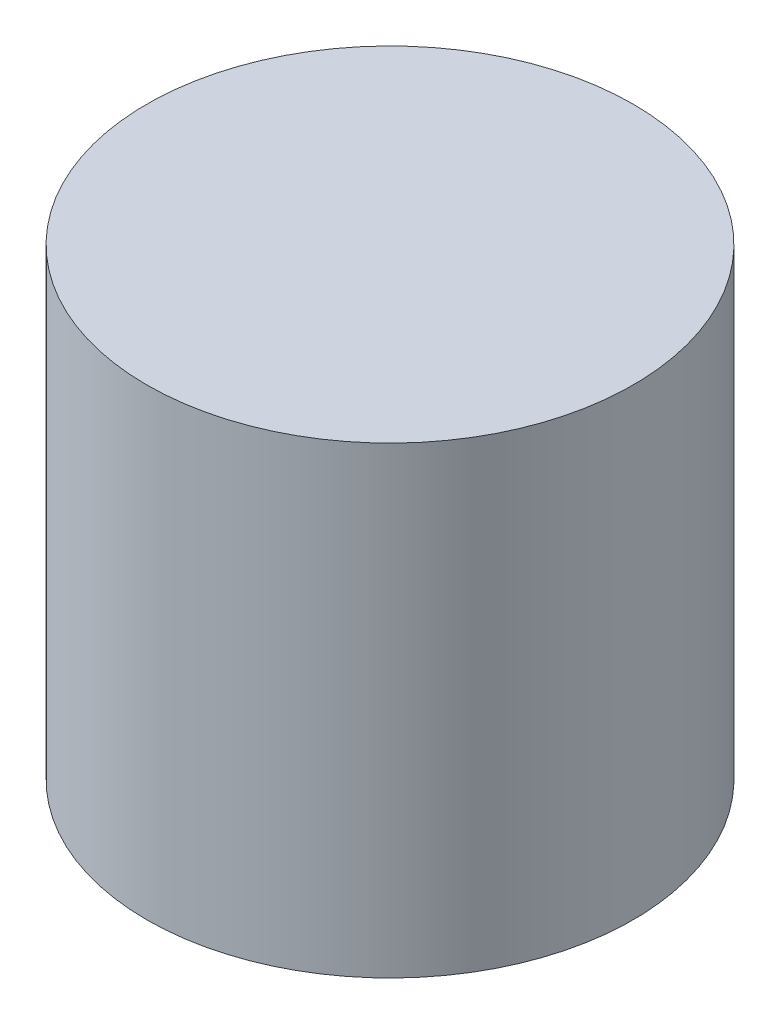
ISO-10303-21;
HEADER;
FILE_DESCRIPTION(('STEP AP214'),'2;1');
FILE_NAME('part.step','',(''),(''),'','','');
FILE_SCHEMA(('AUTOMOTIVE_DESIGN { 1 0 10303 214 1 1 1 1 }'));
ENDSEC;
DATA;
#1=APPLICATION_CONTEXT('core data for automotive mechanical design processes');
#2=APPLICATION_PROTOCOL_DEFINITION('international standard','automotive_design',2000,#1);
#3=PRODUCT_CONTEXT('',#1,'mechanical');
#4=PRODUCT('Part','Part','',(#3));
#5=PRODUCT_RELATED_PRODUCT_CATEGORY('part','',(#4));
#6=PRODUCT_DEFINITION_FORMATION('','',#4);
#7=PRODUCT_DEFINITION_CONTEXT('part definition',#1,'design');
#8=PRODUCT_DEFINITION('design','',#6,#7);
#9=PRODUCT_DEFINITION_SHAPE('','',#8);
#10=(LENGTH_UNIT() NAMED_UNIT(*) SI_UNIT(.MILLI.,.METRE.));
#11=(NAMED_UNIT(*) PLANE_ANGLE_UNIT() SI_UNIT($,.RADIAN.));
#12=(NAMED_UNIT(*) SI_UNIT($,.STERADIAN.) SOLID_ANGLE_UNIT());
#13=UNCERTAINTY_MEASURE_WITH_UNIT(LENGTH_MEASURE(1.E-05),#10,'distance_accuracy_value','');
#14=(GEOMETRIC_REPRESENTATION_CONTEXT(3) GLOBAL_UNCERTAINTY_ASSIGNED_CONTEXT((#13)) GLOBAL_UNIT_ASSIGNED_CONTEXT((#10,
#11,#12)) REPRESENTATION_CONTEXT('',''));
#15=CARTESIAN_POINT('',(0.,0.,0.));
#16=DIRECTION('',(0.,0.,1.));
#17=DIRECTION('',(1.,0.,0.));
#18=AXIS2_PLACEMENT_3D('',#15,#16,#17);
#19=CARTESIAN_POINT('',(0.,20.,0.));
#20=DIRECTION('',(0.,-1.,0.));
#21=DIRECTION('',(0.,0.,-1.));
#22=AXIS2_PLACEMENT_3D('',#19,#20,#21);
#23=CYLINDRICAL_SURFACE('',#22,10.5);
#24=CARTESIAN_POINT('',(0.,20.,0.));
#25=DIRECTION('',(0.,1.,0.));
#26=DIRECTION('',(0.,0.,1.));
#27=AXIS2_PLACEMENT_3D('',#24,#25,#26);
#28=CIRCLE('',#27,10.5);
#29=CARTESIAN_POINT('',(0.,20.,10.5));
#30=VERTEX_POINT('',#29);
#31=EDGE_CURVE('E10',#30,#30,#28,.T.);
#32=ORIENTED_EDGE('',*,*,#31,.F.);
#33=EDGE_LOOP('',(#32));
#34=FACE_BOUND('',#33,.T.);
#35=CARTESIAN_POINT('',(0.,0.,0.));
#36=DIRECTION('',(0.,1.,0.));
#37=DIRECTION('',(0.,0.,1.));
#38=AXIS2_PLACEMENT_3D('',#35,#36,#37);
#39=CIRCLE('',#38,10.5);
#40=CARTESIAN_POINT('',(0.,0.,10.5));
#41=VERTEX_POINT('',#40);
#42=EDGE_CURVE('E34',#41,#41,#39,.T.);
#43=ORIENTED_EDGE('',*,*,#42,.T.);
#44=EDGE_LOOP('',(#43));
#45=FACE_BOUND('',#44,.T.);
#46=ADVANCED_FACE('F31',(#34,#45),#23,.T.);
#47=CARTESIAN_POINT('',(0.,20.,0.));
#48=DIRECTION('',(0.,1.,0.));
#49=DIRECTION('',(0.,0.,1.));
#50=AXIS2_PLACEMENT_3D('',#47,#48,#49);
#51=PLANE('',#50);
#52=ORIENTED_EDGE('',*,*,#31,.T.);
#53=EDGE_LOOP('',(#52));
#54=FACE_BOUND('',#53,.T.);
#55=ADVANCED_FACE('F46',(#54),#51,.T.);
#56=CARTESIAN_POINT('',(0.,0.,0.));
#57=DIRECTION('',(0.,1.,0.));
#58=DIRECTION('',(0.,0.,1.));
#59=AXIS2_PLACEMENT_3D('',#56,#57,#58);
#60=PLANE('',#59);
#61=ORIENTED_EDGE('',*,*,#42,.F.);
#62=EDGE_LOOP('',(#61));
#63=FACE_BOUND('',#62,.T.);
#64=ADVANCED_FACE('F44',(#63),#60,.F.);
#65=CLOSED_SHELL('',(#46,#55,#64));
#66=MANIFOLD_SOLID_BREP('B2',#65);
#67=ADVANCED_BREP_SHAPE_REPRESENTATION('',(#18,#66),#14);
#68=SHAPE_DEFINITION_REPRESENTATION(#9,#67);
ENDSEC;
END-ISO-10303-21;
